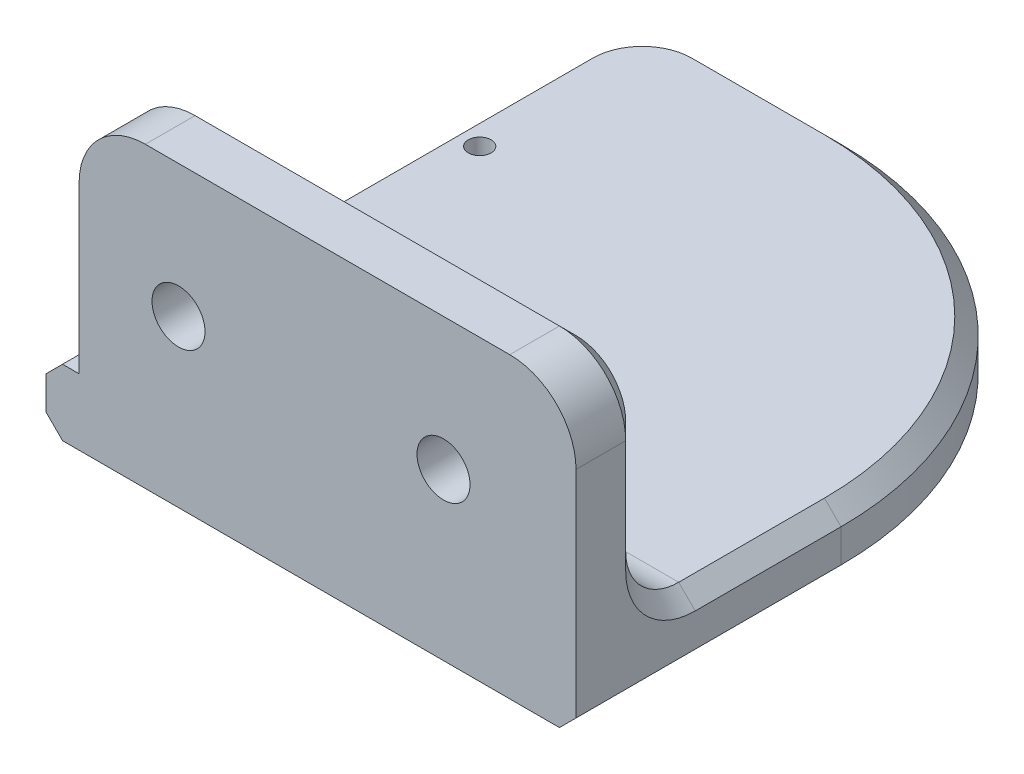
ISO-10303-21;
HEADER;
FILE_DESCRIPTION(('STEP AP214'),'2;1');
FILE_NAME('part.step','',(''),(''),'','','');
FILE_SCHEMA(('AUTOMOTIVE_DESIGN { 1 0 10303 214 1 1 1 1 }'));
ENDSEC;
DATA;
#1=APPLICATION_CONTEXT('core data for automotive mechanical design processes');
#2=APPLICATION_PROTOCOL_DEFINITION('international standard','automotive_design',2000,#1);
#3=PRODUCT_CONTEXT('',#1,'mechanical');
#4=PRODUCT('Part','Part','',(#3));
#5=PRODUCT_RELATED_PRODUCT_CATEGORY('part','',(#4));
#6=PRODUCT_DEFINITION_FORMATION('','',#4);
#7=PRODUCT_DEFINITION_CONTEXT('part definition',#1,'design');
#8=PRODUCT_DEFINITION('design','',#6,#7);
#9=PRODUCT_DEFINITION_SHAPE('','',#8);
#10=(LENGTH_UNIT() NAMED_UNIT(*) SI_UNIT(.MILLI.,.METRE.));
#11=(NAMED_UNIT(*) PLANE_ANGLE_UNIT() SI_UNIT($,.RADIAN.));
#12=(NAMED_UNIT(*) SI_UNIT($,.STERADIAN.) SOLID_ANGLE_UNIT());
#13=UNCERTAINTY_MEASURE_WITH_UNIT(LENGTH_MEASURE(1.E-05),#10,'distance_accuracy_value','');
#14=(GEOMETRIC_REPRESENTATION_CONTEXT(3) GLOBAL_UNCERTAINTY_ASSIGNED_CONTEXT((#13)) GLOBAL_UNIT_ASSIGNED_CONTEXT((#10,
#11,#12)) REPRESENTATION_CONTEXT('',''));
#15=CARTESIAN_POINT('',(0.,0.,0.));
#16=DIRECTION('',(0.,0.,1.));
#17=DIRECTION('',(1.,0.,0.));
#18=AXIS2_PLACEMENT_3D('',#15,#16,#17);
#19=CARTESIAN_POINT('',(50.8,0.,-57.15));
#20=DIRECTION('',(0.,1.,0.));
#21=DIRECTION('',(0.,0.,1.));
#22=AXIS2_PLACEMENT_3D('',#19,#20,#21);
#23=PLANE('',#22);
#24=CARTESIAN_POINT('',(13.9065,0.,-15.875));
#25=DIRECTION('',(0.,-1.,0.));
#26=DIRECTION('',(0.,0.,-1.));
#27=AXIS2_PLACEMENT_3D('',#24,#25,#26);
#28=CIRCLE('',#27,1.0922);
#29=CARTESIAN_POINT('',(13.9065,0.,-16.9672));
#30=VERTEX_POINT('',#29);
#31=EDGE_CURVE('E220',#30,#30,#28,.T.);
#32=ORIENTED_EDGE('',*,*,#31,.F.);
#33=EDGE_LOOP('',(#32));
#34=FACE_BOUND('',#33,.T.);
#35=CARTESIAN_POINT('',(3.49249999999999,0.,-38.0746));
#36=DIRECTION('',(0.,-1.,0.));
#37=DIRECTION('',(0.,0.,-1.));
#38=AXIS2_PLACEMENT_3D('',#35,#36,#37);
#39=CIRCLE('',#38,1.0922);
#40=CARTESIAN_POINT('',(3.49249999999999,0.,-39.1668));
#41=VERTEX_POINT('',#40);
#42=EDGE_CURVE('E211',#41,#41,#39,.T.);
#43=ORIENTED_EDGE('',*,*,#42,.F.);
#44=EDGE_LOOP('',(#43));
#45=FACE_BOUND('',#44,.T.);
#46=CARTESIAN_POINT('',(19.05,0.,-25.4));
#47=DIRECTION('',(0.,1.,0.));
#48=DIRECTION('',(0.,0.,1.));
#49=AXIS2_PLACEMENT_3D('',#46,#47,#48);
#50=CIRCLE('',#49,30.1625);
#51=CARTESIAN_POINT('',(19.05,0.,-55.5625));
#52=VERTEX_POINT('',#51);
#53=CARTESIAN_POINT('',(49.2125,0.,-25.4));
#54=VERTEX_POINT('',#53);
#55=EDGE_CURVE('E330',#52,#54,#50,.F.);
#56=ORIENTED_EDGE('',*,*,#55,.T.);
#57=DIRECTION('',(0.,0.,1.));
#58=VECTOR('',#57,1.);
#59=CARTESIAN_POINT('',(49.2125,0.,-57.15));
#60=LINE('',#59,#58);
#61=CARTESIAN_POINT('',(49.2125,0.,0.));
#62=VERTEX_POINT('',#61);
#63=EDGE_CURVE('E333',#54,#62,#60,.T.);
#64=ORIENTED_EDGE('',*,*,#63,.T.);
#65=DIRECTION('',(-1.,0.,0.));
#66=VECTOR('',#65,1.);
#67=CARTESIAN_POINT('',(50.8,0.,0.));
#68=LINE('',#67,#66);
#69=CARTESIAN_POINT('',(1.5875,0.,0.));
#70=VERTEX_POINT('',#69);
#71=EDGE_CURVE('E250',#62,#70,#68,.T.);
#72=ORIENTED_EDGE('',*,*,#71,.T.);
#73=DIRECTION('',(0.,0.,-1.));
#74=VECTOR('',#73,1.);
#75=CARTESIAN_POINT('',(1.5875,0.,-50.8));
#76=LINE('',#75,#74);
#77=CARTESIAN_POINT('',(1.5875,0.,-50.8));
#78=VERTEX_POINT('',#77);
#79=EDGE_CURVE('E321',#70,#78,#76,.T.);
#80=ORIENTED_EDGE('',*,*,#79,.T.);
#81=CARTESIAN_POINT('',(6.35,0.,-50.8));
#82=DIRECTION('',(0.,1.,0.));
#83=DIRECTION('',(0.,0.,1.));
#84=AXIS2_PLACEMENT_3D('',#81,#82,#83);
#85=CIRCLE('',#84,4.7625);
#86=CARTESIAN_POINT('',(6.35,0.,-55.5625));
#87=VERTEX_POINT('',#86);
#88=EDGE_CURVE('E324',#78,#87,#85,.F.);
#89=ORIENTED_EDGE('',*,*,#88,.T.);
#90=DIRECTION('',(1.,0.,0.));
#91=VECTOR('',#90,1.);
#92=CARTESIAN_POINT('',(50.8,0.,-55.5625));
#93=LINE('',#92,#91);
#94=EDGE_CURVE('E327',#87,#52,#93,.T.);
#95=ORIENTED_EDGE('',*,*,#94,.T.);
#96=EDGE_LOOP('',(#56,#64,#72,#80,#89,#95));
#97=FACE_BOUND('',#96,.T.);
#98=ADVANCED_FACE('F41',(#34,#45,#97),#23,.F.);
#99=CARTESIAN_POINT('',(50.8,6.35,-57.15));
#100=DIRECTION('',(0.,0.,1.));
#101=DIRECTION('',(1.,0.,0.));
#102=AXIS2_PLACEMENT_3D('',#99,#100,#101);
#103=PLANE('',#102);
#104=DIRECTION('',(0.,1.,0.));
#105=VECTOR('',#104,1.);
#106=CARTESIAN_POINT('',(19.05,6.35,-57.15));
#107=LINE('',#106,#105);
#108=CARTESIAN_POINT('',(19.05,4.76249999999999,-57.15));
#109=VERTEX_POINT('',#108);
#110=CARTESIAN_POINT('',(19.05,1.58750000000001,-57.15));
#111=VERTEX_POINT('',#110);
#112=EDGE_CURVE('E270',#109,#111,#107,.F.);
#113=ORIENTED_EDGE('',*,*,#112,.T.);
#114=DIRECTION('',(-1.,0.,0.));
#115=VECTOR('',#114,1.);
#116=CARTESIAN_POINT('',(50.8,1.58750000000001,-57.15));
#117=LINE('',#116,#115);
#118=CARTESIAN_POINT('',(6.35,1.58750000000001,-57.15));
#119=VERTEX_POINT('',#118);
#120=EDGE_CURVE('E354',#111,#119,#117,.T.);
#121=ORIENTED_EDGE('',*,*,#120,.T.);
#122=DIRECTION('',(0.,1.,0.));
#123=VECTOR('',#122,1.);
#124=CARTESIAN_POINT('',(6.35,6.35,-57.15));
#125=LINE('',#124,#123);
#126=CARTESIAN_POINT('',(6.35,4.76249999999999,-57.15));
#127=VERTEX_POINT('',#126);
#128=EDGE_CURVE('E292',#119,#127,#125,.T.);
#129=ORIENTED_EDGE('',*,*,#128,.T.);
#130=DIRECTION('',(1.,0.,0.));
#131=VECTOR('',#130,1.);
#132=CARTESIAN_POINT('',(50.8,4.76249999999999,-57.15));
#133=LINE('',#132,#131);
#134=EDGE_CURVE('E351',#127,#109,#133,.T.);
#135=ORIENTED_EDGE('',*,*,#134,.T.);
#136=EDGE_LOOP('',(#113,#121,#129,#135));
#137=FACE_BOUND('',#136,.T.);
#138=ADVANCED_FACE('F428',(#137),#103,.F.);
#139=CARTESIAN_POINT('',(50.8,6.35,-6.35000000000001));
#140=DIRECTION('',(0.,-1.,0.));
#141=DIRECTION('',(0.,0.,-1.));
#142=AXIS2_PLACEMENT_3D('',#139,#140,#141);
#143=PLANE('',#142);
#144=CARTESIAN_POINT('',(13.9065,6.35,-15.875));
#145=DIRECTION('',(0.,-1.,0.));
#146=DIRECTION('',(0.,0.,-1.));
#147=AXIS2_PLACEMENT_3D('',#144,#145,#146);
#148=CIRCLE('',#147,1.0922);
#149=CARTESIAN_POINT('',(13.9065,6.35,-16.9672));
#150=VERTEX_POINT('',#149);
#151=EDGE_CURVE('E237',#150,#150,#148,.T.);
#152=ORIENTED_EDGE('',*,*,#151,.T.);
#153=EDGE_LOOP('',(#152));
#154=FACE_BOUND('',#153,.T.);
#155=CARTESIAN_POINT('',(3.49249999999999,6.35,-38.0746));
#156=DIRECTION('',(0.,-1.,0.));
#157=DIRECTION('',(0.,0.,-1.));
#158=AXIS2_PLACEMENT_3D('',#155,#156,#157);
#159=CIRCLE('',#158,1.0922);
#160=CARTESIAN_POINT('',(3.49249999999999,6.35,-39.1668));
#161=VERTEX_POINT('',#160);
#162=EDGE_CURVE('E224',#161,#161,#159,.T.);
#163=ORIENTED_EDGE('',*,*,#162,.T.);
#164=EDGE_LOOP('',(#163));
#165=FACE_BOUND('',#164,.T.);
#166=CARTESIAN_POINT('',(6.35,6.35,-50.8));
#167=DIRECTION('',(0.,-1.,0.));
#168=DIRECTION('',(0.,0.,-1.));
#169=AXIS2_PLACEMENT_3D('',#166,#167,#168);
#170=CIRCLE('',#169,4.76249999999999);
#171=CARTESIAN_POINT('',(6.35,6.35,-55.5625));
#172=VERTEX_POINT('',#171);
#173=CARTESIAN_POINT('',(1.58750000000001,6.35,-50.8));
#174=VERTEX_POINT('',#173);
#175=EDGE_CURVE('E378',#172,#174,#170,.F.);
#176=ORIENTED_EDGE('',*,*,#175,.T.);
#177=DIRECTION('',(0.,0.,1.));
#178=VECTOR('',#177,1.);
#179=CARTESIAN_POINT('',(1.58750000000001,6.35,0.));
#180=LINE('',#179,#178);
#181=CARTESIAN_POINT('',(1.58750000000001,6.35,0.));
#182=VERTEX_POINT('',#181);
#183=EDGE_CURVE('E216',#174,#182,#180,.T.);
#184=ORIENTED_EDGE('',*,*,#183,.T.);
#185=DIRECTION('',(-1.,0.,0.));
#186=VECTOR('',#185,1.);
#187=CARTESIAN_POINT('',(0.,6.35,0.));
#188=LINE('',#187,#186);
#189=CARTESIAN_POINT('',(3.175,6.35,0.));
#190=VERTEX_POINT('',#189);
#191=EDGE_CURVE('E197',#190,#182,#188,.T.);
#192=ORIENTED_EDGE('',*,*,#191,.F.);
#193=DIRECTION('',(0.,0.,-1.));
#194=VECTOR('',#193,1.);
#195=CARTESIAN_POINT('',(3.175,6.35,0.));
#196=LINE('',#195,#194);
#197=CARTESIAN_POINT('',(3.175,6.35,-7.11153311347649));
#198=VERTEX_POINT('',#197);
#199=EDGE_CURVE('E205',#190,#198,#196,.T.);
#200=ORIENTED_EDGE('',*,*,#199,.T.);
#201=CARTESIAN_POINT('',(3.175,6.35,-7.11153311347649));
#202=CARTESIAN_POINT('',(3.24444363847946,6.35,-7.21876983250076));
#203=CARTESIAN_POINT('',(3.31285109793143,6.35,-7.3266879750251));
#204=CARTESIAN_POINT('',(3.44722928176214,6.35,-7.54407256043046));
#205=CARTESIAN_POINT('',(3.51319928954382,6.35,-7.6535394457565));
#206=CARTESIAN_POINT('',(3.64261401118337,6.35,-7.87468590742769));
#207=CARTESIAN_POINT('',(3.70604474313581,6.35,-7.98637370628575));
#208=CARTESIAN_POINT('',(3.82953440233054,6.35,-8.21158253047548));
#209=CARTESIAN_POINT('',(3.8895936187958,6.35,-8.32510339747965));
#210=CARTESIAN_POINT('',(4.06029994864898,6.35,-8.66158486244164));
#211=CARTESIAN_POINT('',(4.16556342233644,6.35,-8.88733203777219));
#212=CARTESIAN_POINT('',(4.35594513492404,6.35,-9.34687701553492));
#213=CARTESIAN_POINT('',(4.4411029438738,6.35,-9.58065794955575));
#214=CARTESIAN_POINT('',(4.55215671925392,6.35,-9.94791995668368));
#215=CARTESIAN_POINT('',(4.58737905690266,6.35,-10.0785898600617));
#216=CARTESIAN_POINT('',(4.64887860019533,6.35,-10.3420215767551));
#217=CARTESIAN_POINT('',(4.67515716728584,6.35,-10.4747830684607));
#218=CARTESIAN_POINT('',(4.71815034307921,6.35,-10.7440776504218));
#219=CARTESIAN_POINT('',(4.73470379084092,6.35,-10.880637032275));
#220=CARTESIAN_POINT('',(4.75133934998399,6.35,-11.0861967256141));
#221=CARTESIAN_POINT('',(4.7555188162439,6.35,-11.154884101512));
#222=CARTESIAN_POINT('',(4.76110116188327,6.35,-11.2923783661));
#223=CARTESIAN_POINT('',(4.76250375926053,6.35,-11.3611852662181));
#224=CARTESIAN_POINT('',(4.76250000000002,6.35,-11.43));
#225=B_SPLINE_CURVE_WITH_KNOTS('',3,(#201,#202,#203,#204,#205,#206,#207,#208,#209,#210,#211,
#212,#213,#214,#215,#216,#217,#218,#219,#220,#221,#222,#223,#224),.UNSPECIFIED.,.F.,.F.,(4,2,2,
2,2,2,2,2,2,2,2,4),(0.,0.383280804680697,0.766673409388732,1.15194754147302,1.53718857243423,
2.28373818839856,3.02880603505759,3.43454289763531,3.8402179701234,4.25243881083698,
4.45883264214613,4.66524743250321),.UNSPECIFIED.);
#226=CARTESIAN_POINT('',(4.76250000000002,6.35,-11.43));
#227=VERTEX_POINT('',#226);
#228=EDGE_CURVE('E11',#198,#227,#225,.T.);
#229=ORIENTED_EDGE('',*,*,#228,.T.);
#230=DIRECTION('',(-1.,0.,0.));
#231=VECTOR('',#230,1.);
#232=CARTESIAN_POINT('',(50.8,6.35,-11.43));
#233=LINE('',#232,#231);
#234=CARTESIAN_POINT('',(49.2125,6.35,-11.43));
#235=VERTEX_POINT('',#234);
#236=EDGE_CURVE('E304',#227,#235,#233,.F.);
#237=ORIENTED_EDGE('',*,*,#236,.T.);
#238=DIRECTION('',(0.,0.,-1.));
#239=VECTOR('',#238,1.);
#240=CARTESIAN_POINT('',(49.2125,6.35,-6.35000000000001));
#241=LINE('',#240,#239);
#242=CARTESIAN_POINT('',(49.2125,6.35,-25.4));
#243=VERTEX_POINT('',#242);
#244=EDGE_CURVE('E369',#235,#243,#241,.T.);
#245=ORIENTED_EDGE('',*,*,#244,.T.);
#246=CARTESIAN_POINT('',(19.05,6.35,-25.4));
#247=DIRECTION('',(0.,-1.,0.));
#248=DIRECTION('',(0.,0.,-1.));
#249=AXIS2_PLACEMENT_3D('',#246,#247,#248);
#250=CIRCLE('',#249,30.1625);
#251=CARTESIAN_POINT('',(19.05,6.35,-55.5625));
#252=VERTEX_POINT('',#251);
#253=EDGE_CURVE('E372',#243,#252,#250,.F.);
#254=ORIENTED_EDGE('',*,*,#253,.T.);
#255=DIRECTION('',(-1.,0.,0.));
#256=VECTOR('',#255,1.);
#257=CARTESIAN_POINT('',(50.8,6.35,-55.5625));
#258=LINE('',#257,#256);
#259=EDGE_CURVE('E375',#252,#172,#258,.T.);
#260=ORIENTED_EDGE('',*,*,#259,.T.);
#261=EDGE_LOOP('',(#176,#184,#192,#200,#229,#237,#245,#254,#260));
#262=FACE_BOUND('',#261,.T.);
#263=ADVANCED_FACE('F214',(#154,#165,#262),#143,.F.);
#264=CARTESIAN_POINT('',(50.8,28.575,-6.35));
#265=DIRECTION('',(0.,0.,1.));
#266=DIRECTION('',(0.,-1.,0.));
#267=AXIS2_PLACEMENT_3D('',#264,#265,#266);
#268=PLANE('',#267);
#269=CARTESIAN_POINT('',(12.7,15.875,-6.35000000000001));
#270=DIRECTION('',(0.,0.,1.));
#271=DIRECTION('',(0.,-1.,0.));
#272=AXIS2_PLACEMENT_3D('',#269,#270,#271);
#273=CIRCLE('',#272,2.54);
#274=CARTESIAN_POINT('',(12.7,13.335,-6.35000000000001));
#275=VERTEX_POINT('',#274);
#276=EDGE_CURVE('E241',#275,#275,#273,.T.);
#277=ORIENTED_EDGE('',*,*,#276,.T.);
#278=EDGE_LOOP('',(#277));
#279=FACE_BOUND('',#278,.T.);
#280=CARTESIAN_POINT('',(38.1,15.875,-6.35000000000001));
#281=DIRECTION('',(0.,0.,1.));
#282=DIRECTION('',(0.,-1.,0.));
#283=AXIS2_PLACEMENT_3D('',#280,#281,#282);
#284=CIRCLE('',#283,2.54);
#285=CARTESIAN_POINT('',(38.1,13.335,-6.35000000000001));
#286=VERTEX_POINT('',#285);
#287=EDGE_CURVE('E232',#286,#286,#284,.T.);
#288=ORIENTED_EDGE('',*,*,#287,.T.);
#289=EDGE_LOOP('',(#288));
#290=FACE_BOUND('',#289,.T.);
#291=CARTESIAN_POINT('',(44.45,22.225,-6.35));
#292=DIRECTION('',(0.,0.,1.));
#293=DIRECTION('',(0.,-1.,0.));
#294=AXIS2_PLACEMENT_3D('',#291,#292,#293);
#295=CIRCLE('',#294,4.7625);
#296=CARTESIAN_POINT('',(44.45,26.9875,-6.35));
#297=VERTEX_POINT('',#296);
#298=CARTESIAN_POINT('',(49.2125,22.225,-6.35));
#299=VERTEX_POINT('',#298);
#300=EDGE_CURVE('E398',#297,#299,#295,.F.);
#301=ORIENTED_EDGE('',*,*,#300,.T.);
#302=DIRECTION('',(0.,-1.,0.));
#303=VECTOR('',#302,1.);
#304=CARTESIAN_POINT('',(49.2125,28.575,-6.35));
#305=LINE('',#304,#303);
#306=CARTESIAN_POINT('',(49.2125,11.43,-6.35));
#307=VERTEX_POINT('',#306);
#308=EDGE_CURVE('E401',#299,#307,#305,.T.);
#309=ORIENTED_EDGE('',*,*,#308,.T.);
#310=DIRECTION('',(-1.,0.,0.));
#311=VECTOR('',#310,1.);
#312=CARTESIAN_POINT('',(3.175,11.43,-6.35));
#313=LINE('',#312,#311);
#314=CARTESIAN_POINT('',(4.76250000000002,11.43,-6.35));
#315=VERTEX_POINT('',#314);
#316=EDGE_CURVE('E300',#307,#315,#313,.T.);
#317=ORIENTED_EDGE('',*,*,#316,.T.);
#318=DIRECTION('',(0.,1.,0.));
#319=VECTOR('',#318,1.);
#320=CARTESIAN_POINT('',(4.76250000000002,28.575,-6.35));
#321=LINE('',#320,#319);
#322=CARTESIAN_POINT('',(4.76250000000002,22.225,-6.35));
#323=VERTEX_POINT('',#322);
#324=EDGE_CURVE('E389',#315,#323,#321,.T.);
#325=ORIENTED_EDGE('',*,*,#324,.T.);
#326=CARTESIAN_POINT('',(9.525,22.225,-6.35));
#327=DIRECTION('',(0.,0.,1.));
#328=DIRECTION('',(0.,-1.,0.));
#329=AXIS2_PLACEMENT_3D('',#326,#327,#328);
#330=CIRCLE('',#329,4.7625);
#331=CARTESIAN_POINT('',(9.525,26.9875,-6.35));
#332=VERTEX_POINT('',#331);
#333=EDGE_CURVE('E392',#323,#332,#330,.F.);
#334=ORIENTED_EDGE('',*,*,#333,.T.);
#335=DIRECTION('',(1.,0.,0.));
#336=VECTOR('',#335,1.);
#337=CARTESIAN_POINT('',(50.8,26.9875,-6.35));
#338=LINE('',#337,#336);
#339=EDGE_CURVE('E395',#332,#297,#338,.T.);
#340=ORIENTED_EDGE('',*,*,#339,.T.);
#341=EDGE_LOOP('',(#301,#309,#317,#325,#334,#340));
#342=FACE_BOUND('',#341,.T.);
#343=ADVANCED_FACE('F427',(#279,#290,#342),#268,.F.);
#344=CARTESIAN_POINT('',(50.8,28.575,0.));
#345=DIRECTION('',(0.,-1.,0.));
#346=DIRECTION('',(0.,0.,-1.));
#347=AXIS2_PLACEMENT_3D('',#344,#345,#346);
#348=PLANE('',#347);
#349=DIRECTION('',(0.,0.,1.));
#350=VECTOR('',#349,1.);
#351=CARTESIAN_POINT('',(44.45,28.575,0.));
#352=LINE('',#351,#350);
#353=CARTESIAN_POINT('',(44.45,28.575,0.));
#354=VERTEX_POINT('',#353);
#355=CARTESIAN_POINT('',(44.45,28.575,-4.76249999999999));
#356=VERTEX_POINT('',#355);
#357=EDGE_CURVE('E285',#354,#356,#352,.F.);
#358=ORIENTED_EDGE('',*,*,#357,.T.);
#359=DIRECTION('',(-1.,0.,0.));
#360=VECTOR('',#359,1.);
#361=CARTESIAN_POINT('',(50.8,28.575,-4.76249999999999));
#362=LINE('',#361,#360);
#363=CARTESIAN_POINT('',(9.525,28.575,-4.76249999999999));
#364=VERTEX_POINT('',#363);
#365=EDGE_CURVE('E407',#356,#364,#362,.T.);
#366=ORIENTED_EDGE('',*,*,#365,.T.);
#367=DIRECTION('',(0.,0.,-1.));
#368=VECTOR('',#367,1.);
#369=CARTESIAN_POINT('',(9.525,28.575,0.));
#370=LINE('',#369,#368);
#371=CARTESIAN_POINT('',(9.525,28.575,0.));
#372=VERTEX_POINT('',#371);
#373=EDGE_CURVE('E282',#364,#372,#370,.F.);
#374=ORIENTED_EDGE('',*,*,#373,.T.);
#375=DIRECTION('',(-1.,0.,0.));
#376=VECTOR('',#375,1.);
#377=CARTESIAN_POINT('',(50.8,28.575,0.));
#378=LINE('',#377,#376);
#379=EDGE_CURVE('E257',#354,#372,#378,.T.);
#380=ORIENTED_EDGE('',*,*,#379,.F.);
#381=EDGE_LOOP('',(#358,#366,#374,#380));
#382=FACE_BOUND('',#381,.T.);
#383=ADVANCED_FACE('F681',(#382),#348,.F.);
#384=CARTESIAN_POINT('',(50.8,0.,0.));
#385=DIRECTION('',(0.,0.,-1.));
#386=DIRECTION('',(-1.,0.,0.));
#387=AXIS2_PLACEMENT_3D('',#384,#385,#386);
#388=PLANE('',#387);
#389=CARTESIAN_POINT('',(12.7,15.875,0.));
#390=DIRECTION('',(0.,0.,1.));
#391=DIRECTION('',(1.,0.,0.));
#392=AXIS2_PLACEMENT_3D('',#389,#390,#391);
#393=CIRCLE('',#392,2.54);
#394=CARTESIAN_POINT('',(15.24,15.875,0.));
#395=VERTEX_POINT('',#394);
#396=EDGE_CURVE('E228',#395,#395,#393,.T.);
#397=ORIENTED_EDGE('',*,*,#396,.F.);
#398=EDGE_LOOP('',(#397));
#399=FACE_BOUND('',#398,.T.);
#400=CARTESIAN_POINT('',(38.1,15.875,0.));
#401=DIRECTION('',(0.,0.,1.));
#402=DIRECTION('',(-1.,0.,0.));
#403=AXIS2_PLACEMENT_3D('',#400,#401,#402);
#404=CIRCLE('',#403,2.54);
#405=CARTESIAN_POINT('',(35.56,15.875,0.));
#406=VERTEX_POINT('',#405);
#407=EDGE_CURVE('E233',#406,#406,#404,.T.);
#408=ORIENTED_EDGE('',*,*,#407,.F.);
#409=EDGE_LOOP('',(#408));
#410=FACE_BOUND('',#409,.T.);
#411=ORIENTED_EDGE('',*,*,#71,.F.);
#412=DIRECTION('',(-0.707106781186546,-0.707106781186549,0.));
#413=VECTOR('',#412,1.);
#414=CARTESIAN_POINT('',(50.8,1.58750000000001,0.));
#415=LINE('',#414,#413);
#416=CARTESIAN_POINT('',(50.8,1.58750000000001,0.));
#417=VERTEX_POINT('',#416);
#418=EDGE_CURVE('E342',#62,#417,#415,.F.);
#419=ORIENTED_EDGE('',*,*,#418,.T.);
#420=DIRECTION('',(0.,-1.,0.));
#421=VECTOR('',#420,1.);
#422=CARTESIAN_POINT('',(50.8,0.,0.));
#423=LINE('',#422,#421);
#424=CARTESIAN_POINT('',(50.8,22.225,0.));
#425=VERTEX_POINT('',#424);
#426=EDGE_CURVE('E246',#425,#417,#423,.T.);
#427=ORIENTED_EDGE('',*,*,#426,.F.);
#428=CARTESIAN_POINT('',(44.45,22.225,0.));
#429=DIRECTION('',(0.,0.,-1.));
#430=DIRECTION('',(-1.,0.,0.));
#431=AXIS2_PLACEMENT_3D('',#428,#429,#430);
#432=CIRCLE('',#431,6.35);
#433=EDGE_CURVE('E279',#425,#354,#432,.F.);
#434=ORIENTED_EDGE('',*,*,#433,.T.);
#435=ORIENTED_EDGE('',*,*,#379,.T.);
#436=CARTESIAN_POINT('',(9.525,22.225,0.));
#437=DIRECTION('',(0.,0.,-1.));
#438=DIRECTION('',(-1.,0.,0.));
#439=AXIS2_PLACEMENT_3D('',#436,#437,#438);
#440=CIRCLE('',#439,6.35);
#441=CARTESIAN_POINT('',(3.175,22.225,0.));
#442=VERTEX_POINT('',#441);
#443=EDGE_CURVE('E200',#372,#442,#440,.F.);
#444=ORIENTED_EDGE('',*,*,#443,.T.);
#445=DIRECTION('',(0.,-1.,0.));
#446=VECTOR('',#445,1.);
#447=CARTESIAN_POINT('',(3.175,28.575,0.));
#448=LINE('',#447,#446);
#449=EDGE_CURVE('E192',#442,#190,#448,.T.);
#450=ORIENTED_EDGE('',*,*,#449,.T.);
#451=ORIENTED_EDGE('',*,*,#191,.T.);
#452=DIRECTION('',(-0.707106781186546,-0.707106781186549,0.));
#453=VECTOR('',#452,1.);
#454=CARTESIAN_POINT('',(1.58750000000001,6.35,0.));
#455=LINE('',#454,#453);
#456=CARTESIAN_POINT('',(0.,4.76249999999999,0.));
#457=VERTEX_POINT('',#456);
#458=EDGE_CURVE('E336',#182,#457,#455,.T.);
#459=ORIENTED_EDGE('',*,*,#458,.T.);
#460=DIRECTION('',(0.,-1.,0.));
#461=VECTOR('',#460,1.);
#462=CARTESIAN_POINT('',(0.,0.,0.));
#463=LINE('',#462,#461);
#464=CARTESIAN_POINT('',(0.,1.58750000000001,0.));
#465=VERTEX_POINT('',#464);
#466=EDGE_CURVE('E245',#457,#465,#463,.T.);
#467=ORIENTED_EDGE('',*,*,#466,.T.);
#468=DIRECTION('',(0.707106781186546,-0.707106781186549,0.));
#469=VECTOR('',#468,1.);
#470=CARTESIAN_POINT('',(1.5875,0.,0.));
#471=LINE('',#470,#469);
#472=EDGE_CURVE('E339',#465,#70,#471,.T.);
#473=ORIENTED_EDGE('',*,*,#472,.T.);
#474=EDGE_LOOP('',(#411,#419,#427,#434,#435,#444,#450,#451,#459,#467,#473));
#475=FACE_BOUND('',#474,.T.);
#476=ADVANCED_FACE('F195',(#399,#410,#475),#388,.F.);
#477=CARTESIAN_POINT('',(50.8,0.,0.));
#478=DIRECTION('',(-1.,0.,0.));
#479=DIRECTION('',(0.,0.,1.));
#480=AXIS2_PLACEMENT_3D('',#477,#478,#479);
#481=PLANE('',#480);
#482=ORIENTED_EDGE('',*,*,#426,.T.);
#483=DIRECTION('',(0.,0.,-1.));
#484=VECTOR('',#483,1.);
#485=CARTESIAN_POINT('',(50.8,1.58750000000001,0.));
#486=LINE('',#485,#484);
#487=CARTESIAN_POINT('',(50.8,1.58750000000001,-25.4));
#488=VERTEX_POINT('',#487);
#489=EDGE_CURVE('E317',#417,#488,#486,.T.);
#490=ORIENTED_EDGE('',*,*,#489,.T.);
#491=DIRECTION('',(0.,1.,0.));
#492=VECTOR('',#491,1.);
#493=CARTESIAN_POINT('',(50.8,0.,-25.4));
#494=LINE('',#493,#492);
#495=CARTESIAN_POINT('',(50.8,4.76249999999999,-25.4));
#496=VERTEX_POINT('',#495);
#497=EDGE_CURVE('E260',#488,#496,#494,.T.);
#498=ORIENTED_EDGE('',*,*,#497,.T.);
#499=DIRECTION('',(0.,0.,1.));
#500=VECTOR('',#499,1.);
#501=CARTESIAN_POINT('',(50.8,4.76249999999999,0.));
#502=LINE('',#501,#500);
#503=CARTESIAN_POINT('',(50.8,4.76249999999999,-11.43));
#504=VERTEX_POINT('',#503);
#505=EDGE_CURVE('E314',#496,#504,#502,.T.);
#506=ORIENTED_EDGE('',*,*,#505,.T.);
#507=CARTESIAN_POINT('',(50.8,11.43,-11.43));
#508=DIRECTION('',(-1.,0.,0.));
#509=DIRECTION('',(0.,0.,1.));
#510=AXIS2_PLACEMENT_3D('',#507,#508,#509);
#511=CIRCLE('',#510,6.66750000000001);
#512=CARTESIAN_POINT('',(50.8,11.43,-4.7625));
#513=VERTEX_POINT('',#512);
#514=EDGE_CURVE('E311',#504,#513,#511,.T.);
#515=ORIENTED_EDGE('',*,*,#514,.T.);
#516=DIRECTION('',(0.,1.,0.));
#517=VECTOR('',#516,1.);
#518=CARTESIAN_POINT('',(50.8,0.,-4.7625));
#519=LINE('',#518,#517);
#520=CARTESIAN_POINT('',(50.8,22.225,-4.76249999999999));
#521=VERTEX_POINT('',#520);
#522=EDGE_CURVE('E308',#513,#521,#519,.T.);
#523=ORIENTED_EDGE('',*,*,#522,.T.);
#524=DIRECTION('',(0.,0.,1.));
#525=VECTOR('',#524,1.);
#526=CARTESIAN_POINT('',(50.8,22.225,0.));
#527=LINE('',#526,#525);
#528=EDGE_CURVE('E274',#521,#425,#527,.T.);
#529=ORIENTED_EDGE('',*,*,#528,.T.);
#530=EDGE_LOOP('',(#482,#490,#498,#506,#515,#523,#529));
#531=FACE_BOUND('',#530,.T.);
#532=ADVANCED_FACE('F664',(#531),#481,.F.);
#533=CARTESIAN_POINT('',(0.,0.,0.));
#534=DIRECTION('',(-1.,0.,0.));
#535=DIRECTION('',(0.,0.,1.));
#536=AXIS2_PLACEMENT_3D('',#533,#534,#535);
#537=PLANE('',#536);
#538=DIRECTION('',(0.,1.,0.));
#539=VECTOR('',#538,1.);
#540=CARTESIAN_POINT('',(0.,0.,-50.8));
#541=LINE('',#540,#539);
#542=CARTESIAN_POINT('',(0.,4.76249999999999,-50.8));
#543=VERTEX_POINT('',#542);
#544=CARTESIAN_POINT('',(0.,1.58750000000001,-50.8));
#545=VERTEX_POINT('',#544);
#546=EDGE_CURVE('E296',#543,#545,#541,.F.);
#547=ORIENTED_EDGE('',*,*,#546,.T.);
#548=DIRECTION('',(0.,0.,1.));
#549=VECTOR('',#548,1.);
#550=CARTESIAN_POINT('',(0.,1.58750000000001,0.));
#551=LINE('',#550,#549);
#552=EDGE_CURVE('E366',#545,#465,#551,.T.);
#553=ORIENTED_EDGE('',*,*,#552,.T.);
#554=ORIENTED_EDGE('',*,*,#466,.F.);
#555=DIRECTION('',(0.,0.,-1.));
#556=VECTOR('',#555,1.);
#557=CARTESIAN_POINT('',(0.,4.76249999999999,-50.8));
#558=LINE('',#557,#556);
#559=EDGE_CURVE('E363',#457,#543,#558,.T.);
#560=ORIENTED_EDGE('',*,*,#559,.T.);
#561=EDGE_LOOP('',(#547,#553,#554,#560));
#562=FACE_BOUND('',#561,.T.);
#563=ADVANCED_FACE('F648',(#562),#537,.T.);
#564=CARTESIAN_POINT('',(38.1,15.875,-57.15));
#565=DIRECTION('',(0.,0.,1.));
#566=DIRECTION('',(1.,0.,0.));
#567=AXIS2_PLACEMENT_3D('',#564,#565,#566);
#568=CYLINDRICAL_SURFACE('',#567,2.54);
#569=ORIENTED_EDGE('',*,*,#407,.T.);
#570=EDGE_LOOP('',(#569));
#571=FACE_BOUND('',#570,.T.);
#572=ORIENTED_EDGE('',*,*,#287,.F.);
#573=EDGE_LOOP('',(#572));
#574=FACE_BOUND('',#573,.T.);
#575=ADVANCED_FACE('F695',(#571,#574),#568,.F.);
#576=CARTESIAN_POINT('',(12.7,15.875,-57.15));
#577=DIRECTION('',(0.,0.,1.));
#578=DIRECTION('',(1.,0.,0.));
#579=AXIS2_PLACEMENT_3D('',#576,#577,#578);
#580=CYLINDRICAL_SURFACE('',#579,2.54);
#581=ORIENTED_EDGE('',*,*,#396,.T.);
#582=EDGE_LOOP('',(#581));
#583=FACE_BOUND('',#582,.T.);
#584=ORIENTED_EDGE('',*,*,#276,.F.);
#585=EDGE_LOOP('',(#584));
#586=FACE_BOUND('',#585,.T.);
#587=ADVANCED_FACE('F697',(#583,#586),#580,.F.);
#588=CARTESIAN_POINT('',(3.49249999999999,28.575,-38.0746));
#589=DIRECTION('',(0.,-1.,0.));
#590=DIRECTION('',(0.,0.,-1.));
#591=AXIS2_PLACEMENT_3D('',#588,#589,#590);
#592=CYLINDRICAL_SURFACE('',#591,1.0922);
#593=ORIENTED_EDGE('',*,*,#42,.T.);
#594=EDGE_LOOP('',(#593));
#595=FACE_BOUND('',#594,.T.);
#596=ORIENTED_EDGE('',*,*,#162,.F.);
#597=EDGE_LOOP('',(#596));
#598=FACE_BOUND('',#597,.T.);
#599=ADVANCED_FACE('F704',(#595,#598),#592,.F.);
#600=CARTESIAN_POINT('',(13.9065,28.575,-15.875));
#601=DIRECTION('',(0.,-1.,0.));
#602=DIRECTION('',(0.,0.,-1.));
#603=AXIS2_PLACEMENT_3D('',#600,#601,#602);
#604=CYLINDRICAL_SURFACE('',#603,1.0922);
#605=ORIENTED_EDGE('',*,*,#31,.T.);
#606=EDGE_LOOP('',(#605));
#607=FACE_BOUND('',#606,.T.);
#608=ORIENTED_EDGE('',*,*,#151,.F.);
#609=EDGE_LOOP('',(#608));
#610=FACE_BOUND('',#609,.T.);
#611=ADVANCED_FACE('F440',(#607,#610),#604,.F.);
#612=CARTESIAN_POINT('',(19.05,0.,-25.4));
#613=DIRECTION('',(0.,1.,0.));
#614=DIRECTION('',(0.,0.,1.));
#615=AXIS2_PLACEMENT_3D('',#612,#613,#614);
#616=CYLINDRICAL_SURFACE('',#615,31.75);
#617=ORIENTED_EDGE('',*,*,#497,.F.);
#618=CARTESIAN_POINT('',(19.05,1.58750000000001,-25.4));
#619=DIRECTION('',(0.,1.,0.));
#620=DIRECTION('',(0.,0.,1.));
#621=AXIS2_PLACEMENT_3D('',#618,#619,#620);
#622=CIRCLE('',#621,31.75);
#623=EDGE_CURVE('E348',#488,#111,#622,.T.);
#624=ORIENTED_EDGE('',*,*,#623,.T.);
#625=ORIENTED_EDGE('',*,*,#112,.F.);
#626=CARTESIAN_POINT('',(19.05,4.76249999999999,-25.4));
#627=DIRECTION('',(0.,-1.,0.));
#628=DIRECTION('',(0.,0.,-1.));
#629=AXIS2_PLACEMENT_3D('',#626,#627,#628);
#630=CIRCLE('',#629,31.75);
#631=EDGE_CURVE('E345',#109,#496,#630,.T.);
#632=ORIENTED_EDGE('',*,*,#631,.T.);
#633=EDGE_LOOP('',(#617,#624,#625,#632));
#634=FACE_BOUND('',#633,.T.);
#635=ADVANCED_FACE('F437',(#634),#616,.T.);
#636=CARTESIAN_POINT('',(3.175,28.575,0.));
#637=DIRECTION('',(1.,0.,0.));
#638=DIRECTION('',(0.,1.,0.));
#639=AXIS2_PLACEMENT_3D('',#636,#637,#638);
#640=PLANE('',#639);
#641=DIRECTION('',(0.,0.,-1.));
#642=VECTOR('',#641,1.);
#643=CARTESIAN_POINT('',(3.175,22.225,0.));
#644=LINE('',#643,#642);
#645=CARTESIAN_POINT('',(3.175,22.225,-4.7625));
#646=VERTEX_POINT('',#645);
#647=EDGE_CURVE('E289',#442,#646,#644,.T.);
#648=ORIENTED_EDGE('',*,*,#647,.T.);
#649=DIRECTION('',(0.,-1.,0.));
#650=VECTOR('',#649,1.);
#651=CARTESIAN_POINT('',(3.175,28.575,-4.76249999999999));
#652=LINE('',#651,#650);
#653=CARTESIAN_POINT('',(3.175,11.43,-4.7625));
#654=VERTEX_POINT('',#653);
#655=EDGE_CURVE('E53',#646,#654,#652,.T.);
#656=ORIENTED_EDGE('',*,*,#655,.T.);
#657=CARTESIAN_POINT('',(3.175,11.43,-11.43));
#658=DIRECTION('',(1.,0.,0.));
#659=DIRECTION('',(0.,1.,0.));
#660=AXIS2_PLACEMENT_3D('',#657,#658,#659);
#661=CIRCLE('',#660,6.66750000000001);
#662=EDGE_CURVE('E207',#654,#198,#661,.T.);
#663=ORIENTED_EDGE('',*,*,#662,.T.);
#664=ORIENTED_EDGE('',*,*,#199,.F.);
#665=ORIENTED_EDGE('',*,*,#449,.F.);
#666=EDGE_LOOP('',(#648,#656,#663,#664,#665));
#667=FACE_BOUND('',#666,.T.);
#668=ADVANCED_FACE('F206',(#667),#640,.F.);
#669=CARTESIAN_POINT('',(44.45,22.225,0.));
#670=DIRECTION('',(0.,0.,1.));
#671=DIRECTION('',(1.,0.,0.));
#672=AXIS2_PLACEMENT_3D('',#669,#670,#671);
#673=CYLINDRICAL_SURFACE('',#672,6.35);
#674=ORIENTED_EDGE('',*,*,#528,.F.);
#675=CARTESIAN_POINT('',(44.45,22.225,-4.76249999999999));
#676=DIRECTION('',(0.,0.,1.));
#677=DIRECTION('',(1.,0.,0.));
#678=AXIS2_PLACEMENT_3D('',#675,#676,#677);
#679=CIRCLE('',#678,6.35);
#680=EDGE_CURVE('E404',#521,#356,#679,.T.);
#681=ORIENTED_EDGE('',*,*,#680,.T.);
#682=ORIENTED_EDGE('',*,*,#357,.F.);
#683=ORIENTED_EDGE('',*,*,#433,.F.);
#684=EDGE_LOOP('',(#674,#681,#682,#683));
#685=FACE_BOUND('',#684,.T.);
#686=ADVANCED_FACE('F442',(#685),#673,.T.);
#687=CARTESIAN_POINT('',(9.525,22.225,0.));
#688=DIRECTION('',(0.,0.,-1.));
#689=DIRECTION('',(-1.,0.,0.));
#690=AXIS2_PLACEMENT_3D('',#687,#688,#689);
#691=CYLINDRICAL_SURFACE('',#690,6.35);
#692=ORIENTED_EDGE('',*,*,#373,.F.);
#693=CARTESIAN_POINT('',(9.525,22.225,-4.76249999999999));
#694=DIRECTION('',(0.,0.,1.));
#695=DIRECTION('',(1.,0.,0.));
#696=AXIS2_PLACEMENT_3D('',#693,#694,#695);
#697=CIRCLE('',#696,6.35);
#698=EDGE_CURVE('E68',#364,#646,#697,.T.);
#699=ORIENTED_EDGE('',*,*,#698,.T.);
#700=ORIENTED_EDGE('',*,*,#647,.F.);
#701=ORIENTED_EDGE('',*,*,#443,.F.);
#702=EDGE_LOOP('',(#692,#699,#700,#701));
#703=FACE_BOUND('',#702,.T.);
#704=ADVANCED_FACE('F445',(#703),#691,.T.);
#705=CARTESIAN_POINT('',(6.35,6.35,-50.8));
#706=DIRECTION('',(0.,-1.,0.));
#707=DIRECTION('',(0.,0.,-1.));
#708=AXIS2_PLACEMENT_3D('',#705,#706,#707);
#709=CYLINDRICAL_SURFACE('',#708,6.35);
#710=ORIENTED_EDGE('',*,*,#128,.F.);
#711=CARTESIAN_POINT('',(6.35,1.58750000000001,-50.8));
#712=DIRECTION('',(0.,1.,0.));
#713=DIRECTION('',(0.,0.,1.));
#714=AXIS2_PLACEMENT_3D('',#711,#712,#713);
#715=CIRCLE('',#714,6.35);
#716=EDGE_CURVE('E360',#119,#545,#715,.T.);
#717=ORIENTED_EDGE('',*,*,#716,.T.);
#718=ORIENTED_EDGE('',*,*,#546,.F.);
#719=CARTESIAN_POINT('',(6.35,4.76249999999999,-50.8));
#720=DIRECTION('',(0.,-1.,0.));
#721=DIRECTION('',(0.,0.,-1.));
#722=AXIS2_PLACEMENT_3D('',#719,#720,#721);
#723=CIRCLE('',#722,6.35);
#724=EDGE_CURVE('E357',#543,#127,#723,.T.);
#725=ORIENTED_EDGE('',*,*,#724,.T.);
#726=EDGE_LOOP('',(#710,#717,#718,#725));
#727=FACE_BOUND('',#726,.T.);
#728=ADVANCED_FACE('F449',(#727),#709,.T.);
#729=CARTESIAN_POINT('',(50.8,11.43,-11.43));
#730=DIRECTION('',(1.,0.,0.));
#731=DIRECTION('',(0.,0.,-1.));
#732=AXIS2_PLACEMENT_3D('',#729,#730,#731);
#733=CYLINDRICAL_SURFACE('',#732,5.08);
#734=ORIENTED_EDGE('',*,*,#316,.F.);
#735=CARTESIAN_POINT('',(49.2125,11.43,-11.43));
#736=DIRECTION('',(-1.,0.,0.));
#737=DIRECTION('',(0.,0.,1.));
#738=AXIS2_PLACEMENT_3D('',#735,#736,#737);
#739=CIRCLE('',#738,5.08);
#740=EDGE_CURVE('E386',#307,#235,#739,.F.);
#741=ORIENTED_EDGE('',*,*,#740,.T.);
#742=ORIENTED_EDGE('',*,*,#236,.F.);
#743=CARTESIAN_POINT('',(4.76250000000002,11.43,-11.43));
#744=DIRECTION('',(1.,0.,0.));
#745=DIRECTION('',(0.,0.,-1.));
#746=AXIS2_PLACEMENT_3D('',#743,#744,#745);
#747=CIRCLE('',#746,5.08);
#748=EDGE_CURVE('E383',#227,#315,#747,.F.);
#749=ORIENTED_EDGE('',*,*,#748,.T.);
#750=EDGE_LOOP('',(#734,#741,#742,#749));
#751=FACE_BOUND('',#750,.T.);
#752=ADVANCED_FACE('F452',(#751),#733,.F.);
#753=CARTESIAN_POINT('',(1.5875,0.,-57.15));
#754=DIRECTION('',(-0.707106781186549,-0.707106781186546,0.));
#755=DIRECTION('',(0.,0.,1.));
#756=AXIS2_PLACEMENT_3D('',#753,#754,#755);
#757=PLANE('',#756);
#758=ORIENTED_EDGE('',*,*,#472,.F.);
#759=ORIENTED_EDGE('',*,*,#552,.F.);
#760=DIRECTION('',(-0.707106781186546,0.707106781186549,0.));
#761=VECTOR('',#760,1.);
#762=CARTESIAN_POINT('',(1.5875,0.,-50.8));
#763=LINE('',#762,#761);
#764=EDGE_CURVE('E202',#78,#545,#763,.T.);
#765=ORIENTED_EDGE('',*,*,#764,.F.);
#766=ORIENTED_EDGE('',*,*,#79,.F.);
#767=EDGE_LOOP('',(#758,#759,#765,#766));
#768=FACE_BOUND('',#767,.T.);
#769=ADVANCED_FACE('F456',(#768),#757,.T.);
#770=CARTESIAN_POINT('',(6.35,0.,-50.8));
#771=DIRECTION('',(0.,1.,0.));
#772=DIRECTION('',(0.,0.,1.));
#773=AXIS2_PLACEMENT_3D('',#770,#771,#772);
#774=CONICAL_SURFACE('',#773,4.7625,0.785398163397446);
#775=ORIENTED_EDGE('',*,*,#764,.T.);
#776=ORIENTED_EDGE('',*,*,#716,.F.);
#777=DIRECTION('',(0.,0.707106781186549,-0.707106781186546));
#778=VECTOR('',#777,1.);
#779=CARTESIAN_POINT('',(6.35,0.,-55.5625));
#780=LINE('',#779,#778);
#781=EDGE_CURVE('E623',#87,#119,#780,.T.);
#782=ORIENTED_EDGE('',*,*,#781,.F.);
#783=ORIENTED_EDGE('',*,*,#88,.F.);
#784=EDGE_LOOP('',(#775,#776,#782,#783));
#785=FACE_BOUND('',#784,.T.);
#786=ADVANCED_FACE('F479',(#785),#774,.T.);
#787=CARTESIAN_POINT('',(50.8,1.58750000000001,-57.15));
#788=DIRECTION('',(0.,0.707106781186546,0.707106781186549));
#789=DIRECTION('',(-1.,0.,0.));
#790=AXIS2_PLACEMENT_3D('',#787,#788,#789);
#791=PLANE('',#790);
#792=ORIENTED_EDGE('',*,*,#781,.T.);
#793=ORIENTED_EDGE('',*,*,#120,.F.);
#794=DIRECTION('',(0.,0.707106781186549,-0.707106781186546));
#795=VECTOR('',#794,1.);
#796=CARTESIAN_POINT('',(19.05,0.,-55.5625));
#797=LINE('',#796,#795);
#798=EDGE_CURVE('E581',#52,#111,#797,.T.);
#799=ORIENTED_EDGE('',*,*,#798,.F.);
#800=ORIENTED_EDGE('',*,*,#94,.F.);
#801=EDGE_LOOP('',(#792,#793,#799,#800));
#802=FACE_BOUND('',#801,.T.);
#803=ADVANCED_FACE('F472',(#802),#791,.F.);
#804=CARTESIAN_POINT('',(19.05,0.,-25.4));
#805=DIRECTION('',(0.,1.,0.));
#806=DIRECTION('',(0.,0.,1.));
#807=AXIS2_PLACEMENT_3D('',#804,#805,#806);
#808=CONICAL_SURFACE('',#807,30.1625,0.785398163397446);
#809=ORIENTED_EDGE('',*,*,#798,.T.);
#810=ORIENTED_EDGE('',*,*,#623,.F.);
#811=DIRECTION('',(0.707106781186546,0.707106781186549,0.));
#812=VECTOR('',#811,1.);
#813=CARTESIAN_POINT('',(49.2125,0.,-25.4));
#814=LINE('',#813,#812);
#815=EDGE_CURVE('E421',#54,#488,#814,.T.);
#816=ORIENTED_EDGE('',*,*,#815,.F.);
#817=ORIENTED_EDGE('',*,*,#55,.F.);
#818=EDGE_LOOP('',(#809,#810,#816,#817));
#819=FACE_BOUND('',#818,.T.);
#820=ADVANCED_FACE('F465',(#819),#808,.T.);
#821=CARTESIAN_POINT('',(50.8,1.58750000000001,0.));
#822=DIRECTION('',(-0.707106781186549,0.707106781186546,0.));
#823=DIRECTION('',(0.,0.,-1.));
#824=AXIS2_PLACEMENT_3D('',#821,#822,#823);
#825=PLANE('',#824);
#826=ORIENTED_EDGE('',*,*,#418,.F.);
#827=ORIENTED_EDGE('',*,*,#63,.F.);
#828=ORIENTED_EDGE('',*,*,#815,.T.);
#829=ORIENTED_EDGE('',*,*,#489,.F.);
#830=EDGE_LOOP('',(#826,#827,#828,#829));
#831=FACE_BOUND('',#830,.T.);
#832=ADVANCED_FACE('F459',(#831),#825,.F.);
#833=CARTESIAN_POINT('',(3.175,11.43,-11.43));
#834=DIRECTION('',(-1.,0.,0.));
#835=DIRECTION('',(0.,0.,1.));
#836=AXIS2_PLACEMENT_3D('',#833,#834,#835);
#837=CONICAL_SURFACE('',#836,6.66750000000001,0.785398163397444);
#838=ORIENTED_EDGE('',*,*,#228,.F.);
#839=ORIENTED_EDGE('',*,*,#662,.F.);
#840=DIRECTION('',(-0.70710678118655,0.,0.707106781186544));
#841=VECTOR('',#840,1.);
#842=CARTESIAN_POINT('',(4.76250000000002,11.43,-6.35));
#843=LINE('',#842,#841);
#844=EDGE_CURVE('E47',#315,#654,#843,.T.);
#845=ORIENTED_EDGE('',*,*,#844,.F.);
#846=ORIENTED_EDGE('',*,*,#748,.F.);
#847=EDGE_LOOP('',(#838,#839,#845,#846));
#848=FACE_BOUND('',#847,.T.);
#849=ADVANCED_FACE('F44',(#848),#837,.F.);
#850=CARTESIAN_POINT('',(3.175,28.575,-4.76249999999999));
#851=DIRECTION('',(0.707106781186545,0.,0.70710678118655));
#852=DIRECTION('',(0.,-1.,0.));
#853=AXIS2_PLACEMENT_3D('',#850,#851,#852);
#854=PLANE('',#853);
#855=ORIENTED_EDGE('',*,*,#844,.T.);
#856=ORIENTED_EDGE('',*,*,#655,.F.);
#857=DIRECTION('',(-0.70710678118655,0.,0.707106781186545));
#858=VECTOR('',#857,1.);
#859=CARTESIAN_POINT('',(4.76250000000002,22.225,-6.35));
#860=LINE('',#859,#858);
#861=EDGE_CURVE('E578',#323,#646,#860,.T.);
#862=ORIENTED_EDGE('',*,*,#861,.F.);
#863=ORIENTED_EDGE('',*,*,#324,.F.);
#864=EDGE_LOOP('',(#855,#856,#862,#863));
#865=FACE_BOUND('',#864,.T.);
#866=ADVANCED_FACE('F561',(#865),#854,.F.);
#867=CARTESIAN_POINT('',(9.525,22.225,-6.35));
#868=DIRECTION('',(0.,0.,1.));
#869=DIRECTION('',(1.,0.,0.));
#870=AXIS2_PLACEMENT_3D('',#867,#868,#869);
#871=CONICAL_SURFACE('',#870,4.7625,0.785398163397445);
#872=ORIENTED_EDGE('',*,*,#861,.T.);
#873=ORIENTED_EDGE('',*,*,#698,.F.);
#874=DIRECTION('',(0.,0.707106781186546,0.707106781186549));
#875=VECTOR('',#874,1.);
#876=CARTESIAN_POINT('',(9.525,26.9875,-6.35));
#877=LINE('',#876,#875);
#878=EDGE_CURVE('E582',#332,#364,#877,.T.);
#879=ORIENTED_EDGE('',*,*,#878,.F.);
#880=ORIENTED_EDGE('',*,*,#333,.F.);
#881=EDGE_LOOP('',(#872,#873,#879,#880));
#882=FACE_BOUND('',#881,.T.);
#883=ADVANCED_FACE('F555',(#882),#871,.T.);
#884=CARTESIAN_POINT('',(50.8,28.575,-4.76249999999999));
#885=DIRECTION('',(0.,-0.707106781186545,0.70710678118655));
#886=DIRECTION('',(-1.,0.,0.));
#887=AXIS2_PLACEMENT_3D('',#884,#885,#886);
#888=PLANE('',#887);
#889=ORIENTED_EDGE('',*,*,#878,.T.);
#890=ORIENTED_EDGE('',*,*,#365,.F.);
#891=DIRECTION('',(0.,0.70710678118655,0.707106781186545));
#892=VECTOR('',#891,1.);
#893=CARTESIAN_POINT('',(44.45,26.9875,-6.35));
#894=LINE('',#893,#892);
#895=EDGE_CURVE('E586',#297,#356,#894,.T.);
#896=ORIENTED_EDGE('',*,*,#895,.F.);
#897=ORIENTED_EDGE('',*,*,#339,.F.);
#898=EDGE_LOOP('',(#889,#890,#896,#897));
#899=FACE_BOUND('',#898,.T.);
#900=ADVANCED_FACE('F548',(#899),#888,.F.);
#901=CARTESIAN_POINT('',(44.45,22.225,-6.35));
#902=DIRECTION('',(0.,0.,1.));
#903=DIRECTION('',(1.,0.,0.));
#904=AXIS2_PLACEMENT_3D('',#901,#902,#903);
#905=CONICAL_SURFACE('',#904,4.7625,0.785398163397445);
#906=ORIENTED_EDGE('',*,*,#895,.T.);
#907=ORIENTED_EDGE('',*,*,#680,.F.);
#908=DIRECTION('',(0.707106781186546,0.,0.707106781186549));
#909=VECTOR('',#908,1.);
#910=CARTESIAN_POINT('',(49.2125,22.225,-6.35));
#911=LINE('',#910,#909);
#912=EDGE_CURVE('E592',#299,#521,#911,.T.);
#913=ORIENTED_EDGE('',*,*,#912,.F.);
#914=ORIENTED_EDGE('',*,*,#300,.F.);
#915=EDGE_LOOP('',(#906,#907,#913,#914));
#916=FACE_BOUND('',#915,.T.);
#917=ADVANCED_FACE('F541',(#916),#905,.T.);
#918=CARTESIAN_POINT('',(50.8,0.,-4.7625));
#919=DIRECTION('',(-0.707106781186546,0.,0.707106781186549));
#920=DIRECTION('',(0.,1.,0.));
#921=AXIS2_PLACEMENT_3D('',#918,#919,#920);
#922=PLANE('',#921);
#923=ORIENTED_EDGE('',*,*,#912,.T.);
#924=ORIENTED_EDGE('',*,*,#522,.F.);
#925=DIRECTION('',(0.707106781186549,0.,0.707106781186546));
#926=VECTOR('',#925,1.);
#927=CARTESIAN_POINT('',(49.2125,11.43,-6.35));
#928=LINE('',#927,#926);
#929=EDGE_CURVE('E596',#307,#513,#928,.T.);
#930=ORIENTED_EDGE('',*,*,#929,.F.);
#931=ORIENTED_EDGE('',*,*,#308,.F.);
#932=EDGE_LOOP('',(#923,#924,#930,#931));
#933=FACE_BOUND('',#932,.T.);
#934=ADVANCED_FACE('F534',(#933),#922,.F.);
#935=CARTESIAN_POINT('',(50.8,11.43,-11.43));
#936=DIRECTION('',(1.,0.,0.));
#937=DIRECTION('',(0.,0.,-1.));
#938=AXIS2_PLACEMENT_3D('',#935,#936,#937);
#939=CONICAL_SURFACE('',#938,6.66750000000001,0.785398163397446);
#940=ORIENTED_EDGE('',*,*,#929,.T.);
#941=ORIENTED_EDGE('',*,*,#514,.F.);
#942=DIRECTION('',(0.707106781186549,-0.707106781186546,0.));
#943=VECTOR('',#942,1.);
#944=CARTESIAN_POINT('',(49.2125,6.35,-11.43));
#945=LINE('',#944,#943);
#946=EDGE_CURVE('E600',#235,#504,#945,.T.);
#947=ORIENTED_EDGE('',*,*,#946,.F.);
#948=ORIENTED_EDGE('',*,*,#740,.F.);
#949=EDGE_LOOP('',(#940,#941,#947,#948));
#950=FACE_BOUND('',#949,.T.);
#951=ADVANCED_FACE('F527',(#950),#939,.F.);
#952=CARTESIAN_POINT('',(50.8,4.76249999999999,0.));
#953=DIRECTION('',(-0.707106781186546,-0.707106781186549,0.));
#954=DIRECTION('',(0.,0.,1.));
#955=AXIS2_PLACEMENT_3D('',#952,#953,#954);
#956=PLANE('',#955);
#957=ORIENTED_EDGE('',*,*,#946,.T.);
#958=ORIENTED_EDGE('',*,*,#505,.F.);
#959=DIRECTION('',(0.707106781186549,-0.707106781186546,0.));
#960=VECTOR('',#959,1.);
#961=CARTESIAN_POINT('',(49.2125,6.35,-25.4));
#962=LINE('',#961,#960);
#963=EDGE_CURVE('E604',#243,#496,#962,.T.);
#964=ORIENTED_EDGE('',*,*,#963,.F.);
#965=ORIENTED_EDGE('',*,*,#244,.F.);
#966=EDGE_LOOP('',(#957,#958,#964,#965));
#967=FACE_BOUND('',#966,.T.);
#968=ADVANCED_FACE('F520',(#967),#956,.F.);
#969=CARTESIAN_POINT('',(19.05,6.35,-25.4));
#970=DIRECTION('',(0.,-1.,0.));
#971=DIRECTION('',(0.,0.,-1.));
#972=AXIS2_PLACEMENT_3D('',#969,#970,#971);
#973=CONICAL_SURFACE('',#972,30.1625,0.785398163397446);
#974=ORIENTED_EDGE('',*,*,#963,.T.);
#975=ORIENTED_EDGE('',*,*,#631,.F.);
#976=DIRECTION('',(0.,-0.70710678118655,-0.707106781186545));
#977=VECTOR('',#976,1.);
#978=CARTESIAN_POINT('',(19.05,6.35,-55.5625));
#979=LINE('',#978,#977);
#980=EDGE_CURVE('E608',#252,#109,#979,.T.);
#981=ORIENTED_EDGE('',*,*,#980,.F.);
#982=ORIENTED_EDGE('',*,*,#253,.F.);
#983=EDGE_LOOP('',(#974,#975,#981,#982));
#984=FACE_BOUND('',#983,.T.);
#985=ADVANCED_FACE('F513',(#984),#973,.T.);
#986=CARTESIAN_POINT('',(50.8,6.35,-55.5625));
#987=DIRECTION('',(0.,-0.707106781186546,0.707106781186549));
#988=DIRECTION('',(-1.,0.,0.));
#989=AXIS2_PLACEMENT_3D('',#986,#987,#988);
#990=PLANE('',#989);
#991=ORIENTED_EDGE('',*,*,#980,.T.);
#992=ORIENTED_EDGE('',*,*,#134,.F.);
#993=DIRECTION('',(0.,-0.707106781186549,-0.707106781186546));
#994=VECTOR('',#993,1.);
#995=CARTESIAN_POINT('',(6.35,6.35,-55.5625));
#996=LINE('',#995,#994);
#997=EDGE_CURVE('E612',#172,#127,#996,.T.);
#998=ORIENTED_EDGE('',*,*,#997,.F.);
#999=ORIENTED_EDGE('',*,*,#259,.F.);
#1000=EDGE_LOOP('',(#991,#992,#998,#999));
#1001=FACE_BOUND('',#1000,.T.);
#1002=ADVANCED_FACE('F506',(#1001),#990,.F.);
#1003=CARTESIAN_POINT('',(6.35,6.35,-50.8));
#1004=DIRECTION('',(0.,-1.,0.));
#1005=DIRECTION('',(0.,0.,-1.));
#1006=AXIS2_PLACEMENT_3D('',#1003,#1004,#1005);
#1007=CONICAL_SURFACE('',#1006,4.76249999999999,0.785398163397446);
#1008=ORIENTED_EDGE('',*,*,#997,.T.);
#1009=ORIENTED_EDGE('',*,*,#724,.F.);
#1010=DIRECTION('',(-0.707106781186546,-0.707106781186549,0.));
#1011=VECTOR('',#1010,1.);
#1012=CARTESIAN_POINT('',(1.58750000000001,6.35,-50.8));
#1013=LINE('',#1012,#1011);
#1014=EDGE_CURVE('E616',#174,#543,#1013,.T.);
#1015=ORIENTED_EDGE('',*,*,#1014,.F.);
#1016=ORIENTED_EDGE('',*,*,#175,.F.);
#1017=EDGE_LOOP('',(#1008,#1009,#1015,#1016));
#1018=FACE_BOUND('',#1017,.T.);
#1019=ADVANCED_FACE('F499',(#1018),#1007,.T.);
#1020=CARTESIAN_POINT('',(1.58750000000001,6.35,-6.35000000000001));
#1021=DIRECTION('',(-0.707106781186549,0.707106781186546,0.));
#1022=DIRECTION('',(0.,0.,-1.));
#1023=AXIS2_PLACEMENT_3D('',#1020,#1021,#1022);
#1024=PLANE('',#1023);
#1025=ORIENTED_EDGE('',*,*,#1014,.T.);
#1026=ORIENTED_EDGE('',*,*,#559,.F.);
#1027=ORIENTED_EDGE('',*,*,#458,.F.);
#1028=ORIENTED_EDGE('',*,*,#183,.F.);
#1029=EDGE_LOOP('',(#1025,#1026,#1027,#1028));
#1030=FACE_BOUND('',#1029,.T.);
#1031=ADVANCED_FACE('F493',(#1030),#1024,.T.);
#1032=CLOSED_SHELL('',(#98,#138,#263,#343,#383,#476,#532,#563,#575,#587,#599,#611,#635,#668,
#686,#704,#728,#752,#769,#786,#803,#820,#832,#849,#866,#883,#900,#917,#934,#951,#968,#985,#1002,
#1019,#1031));
#1033=MANIFOLD_SOLID_BREP('B2',#1032);
#1034=ADVANCED_BREP_SHAPE_REPRESENTATION('',(#18,#1033),#14);
#1035=SHAPE_DEFINITION_REPRESENTATION(#9,#1034);
ENDSEC;
END-ISO-10303-21;
